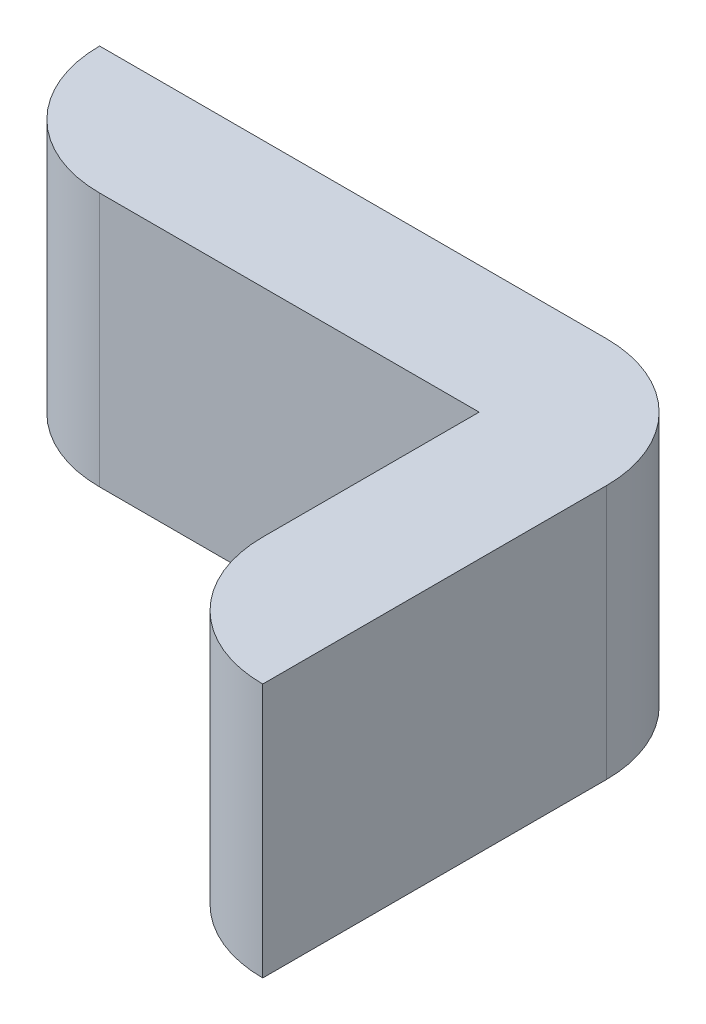
ISO-10303-21;
HEADER;
FILE_DESCRIPTION(('STEP AP214'),'2;1');
FILE_NAME('part.step','',(''),(''),'','','');
FILE_SCHEMA(('AUTOMOTIVE_DESIGN { 1 0 10303 214 1 1 1 1 }'));
ENDSEC;
DATA;
#1=APPLICATION_CONTEXT('core data for automotive mechanical design processes');
#2=APPLICATION_PROTOCOL_DEFINITION('international standard','automotive_design',2000,#1);
#3=PRODUCT_CONTEXT('',#1,'mechanical');
#4=PRODUCT('Part','Part','',(#3));
#5=PRODUCT_RELATED_PRODUCT_CATEGORY('part','',(#4));
#6=PRODUCT_DEFINITION_FORMATION('','',#4);
#7=PRODUCT_DEFINITION_CONTEXT('part definition',#1,'design');
#8=PRODUCT_DEFINITION('design','',#6,#7);
#9=PRODUCT_DEFINITION_SHAPE('','',#8);
#10=(LENGTH_UNIT() NAMED_UNIT(*) SI_UNIT(.MILLI.,.METRE.));
#11=(NAMED_UNIT(*) PLANE_ANGLE_UNIT() SI_UNIT($,.RADIAN.));
#12=(NAMED_UNIT(*) SI_UNIT($,.STERADIAN.) SOLID_ANGLE_UNIT());
#13=UNCERTAINTY_MEASURE_WITH_UNIT(LENGTH_MEASURE(1.E-05),#10,'distance_accuracy_value','');
#14=(GEOMETRIC_REPRESENTATION_CONTEXT(3) GLOBAL_UNCERTAINTY_ASSIGNED_CONTEXT((#13)) GLOBAL_UNIT_ASSIGNED_CONTEXT((#10,
#11,#12)) REPRESENTATION_CONTEXT('',''));
#15=CARTESIAN_POINT('',(0.,0.,0.));
#16=DIRECTION('',(0.,0.,1.));
#17=DIRECTION('',(1.,0.,0.));
#18=AXIS2_PLACEMENT_3D('',#15,#16,#17);
#19=CARTESIAN_POINT('',(-0.396,-1.3462,0.4699));
#20=DIRECTION('',(-1.,0.,0.));
#21=DIRECTION('',(0.,0.,1.));
#22=AXIS2_PLACEMENT_3D('',#19,#20,#21);
#23=PLANE('',#22);
#24=DIRECTION('',(0.,0.,-1.));
#25=VECTOR('',#24,1.);
#26=CARTESIAN_POINT('',(-0.396,-1.3462,0.));
#27=LINE('',#26,#25);
#28=CARTESIAN_POINT('',(-0.396,-1.3462,0.127));
#29=VERTEX_POINT('',#28);
#30=CARTESIAN_POINT('',(-0.396,-1.3462,0.4699));
#31=VERTEX_POINT('',#30);
#32=EDGE_CURVE('E129',#29,#31,#27,.F.);
#33=ORIENTED_EDGE('',*,*,#32,.F.);
#34=DIRECTION('',(0.,-1.,0.));
#35=VECTOR('',#34,1.);
#36=CARTESIAN_POINT('',(-0.396,-1.3462,0.127));
#37=LINE('',#36,#35);
#38=CARTESIAN_POINT('',(-0.396,-1.0922,0.127));
#39=VERTEX_POINT('',#38);
#40=EDGE_CURVE('E82',#39,#29,#37,.T.);
#41=ORIENTED_EDGE('',*,*,#40,.F.);
#42=DIRECTION('',(0.,0.,-1.));
#43=VECTOR('',#42,1.);
#44=CARTESIAN_POINT('',(-0.396,-1.0922,0.));
#45=LINE('',#44,#43);
#46=CARTESIAN_POINT('',(-0.396,-1.0922,0.4699));
#47=VERTEX_POINT('',#46);
#48=EDGE_CURVE('E77',#39,#47,#45,.F.);
#49=ORIENTED_EDGE('',*,*,#48,.T.);
#50=DIRECTION('',(0.,-1.,0.));
#51=VECTOR('',#50,1.);
#52=CARTESIAN_POINT('',(-0.396,-1.3462,0.4699));
#53=LINE('',#52,#51);
#54=EDGE_CURVE('E123',#31,#47,#53,.F.);
#55=ORIENTED_EDGE('',*,*,#54,.F.);
#56=EDGE_LOOP('',(#33,#41,#49,#55));
#57=FACE_BOUND('',#56,.T.);
#58=ADVANCED_FACE('F17',(#57),#23,.F.);
#59=CARTESIAN_POINT('',(-0.396,-1.3462,0.3429));
#60=DIRECTION('',(0.,-1.,0.));
#61=DIRECTION('',(0.,0.,-1.));
#62=AXIS2_PLACEMENT_3D('',#59,#60,#61);
#63=CYLINDRICAL_SURFACE('',#62,0.127);
#64=CARTESIAN_POINT('',(-0.396,-1.0922,0.3429));
#65=DIRECTION('',(0.,-1.,0.));
#66=DIRECTION('',(0.,0.,-1.));
#67=AXIS2_PLACEMENT_3D('',#64,#65,#66);
#68=CIRCLE('',#67,0.127);
#69=CARTESIAN_POINT('',(-0.523,-1.0922,0.3429));
#70=VERTEX_POINT('',#69);
#71=EDGE_CURVE('E107',#47,#70,#68,.T.);
#72=ORIENTED_EDGE('',*,*,#71,.T.);
#73=DIRECTION('',(0.,1.,0.));
#74=VECTOR('',#73,1.);
#75=CARTESIAN_POINT('',(-0.523,-1.3462,0.3429));
#76=LINE('',#75,#74);
#77=CARTESIAN_POINT('',(-0.523,-1.3462,0.3429));
#78=VERTEX_POINT('',#77);
#79=EDGE_CURVE('E118',#70,#78,#76,.F.);
#80=ORIENTED_EDGE('',*,*,#79,.T.);
#81=CARTESIAN_POINT('',(-0.396,-1.3462,0.3429));
#82=DIRECTION('',(0.,-1.,0.));
#83=DIRECTION('',(0.,0.,-1.));
#84=AXIS2_PLACEMENT_3D('',#81,#82,#83);
#85=CIRCLE('',#84,0.127);
#86=EDGE_CURVE('E126',#31,#78,#85,.T.);
#87=ORIENTED_EDGE('',*,*,#86,.F.);
#88=ORIENTED_EDGE('',*,*,#54,.T.);
#89=EDGE_LOOP('',(#72,#80,#87,#88));
#90=FACE_BOUND('',#89,.T.);
#91=ADVANCED_FACE('F133',(#90),#63,.T.);
#92=CARTESIAN_POINT('',(-0.523,-1.3462,0.127));
#93=DIRECTION('',(1.,0.,0.));
#94=DIRECTION('',(0.,0.,-1.));
#95=AXIS2_PLACEMENT_3D('',#92,#93,#94);
#96=PLANE('',#95);
#97=ORIENTED_EDGE('',*,*,#79,.F.);
#98=DIRECTION('',(0.,0.,-1.));
#99=VECTOR('',#98,1.);
#100=CARTESIAN_POINT('',(-0.523,-1.0922,0.));
#101=LINE('',#100,#99);
#102=CARTESIAN_POINT('',(-0.523,-1.0922,0.127));
#103=VERTEX_POINT('',#102);
#104=EDGE_CURVE('E102',#70,#103,#101,.T.);
#105=ORIENTED_EDGE('',*,*,#104,.T.);
#106=DIRECTION('',(0.,1.,0.));
#107=VECTOR('',#106,1.);
#108=CARTESIAN_POINT('',(-0.523,-1.3462,0.127));
#109=LINE('',#108,#107);
#110=CARTESIAN_POINT('',(-0.523,-1.3462,0.127));
#111=VERTEX_POINT('',#110);
#112=EDGE_CURVE('E115',#103,#111,#109,.F.);
#113=ORIENTED_EDGE('',*,*,#112,.T.);
#114=DIRECTION('',(0.,0.,-1.));
#115=VECTOR('',#114,1.);
#116=CARTESIAN_POINT('',(-0.523,-1.3462,0.));
#117=LINE('',#116,#115);
#118=EDGE_CURVE('E128',#78,#111,#117,.T.);
#119=ORIENTED_EDGE('',*,*,#118,.F.);
#120=EDGE_LOOP('',(#97,#105,#113,#119));
#121=FACE_BOUND('',#120,.T.);
#122=ADVANCED_FACE('F158',(#121),#96,.F.);
#123=CARTESIAN_POINT('',(-0.9017,-1.3462,0.127));
#124=DIRECTION('',(0.,0.,-1.));
#125=DIRECTION('',(-1.,0.,0.));
#126=AXIS2_PLACEMENT_3D('',#123,#124,#125);
#127=PLANE('',#126);
#128=ORIENTED_EDGE('',*,*,#112,.F.);
#129=DIRECTION('',(1.,0.,0.));
#130=VECTOR('',#129,1.);
#131=CARTESIAN_POINT('',(-1.0287,-1.0922,0.127));
#132=LINE('',#131,#130);
#133=CARTESIAN_POINT('',(-0.9017,-1.0922,0.127));
#134=VERTEX_POINT('',#133);
#135=EDGE_CURVE('E98',#103,#134,#132,.F.);
#136=ORIENTED_EDGE('',*,*,#135,.T.);
#137=DIRECTION('',(0.,-1.,0.));
#138=VECTOR('',#137,1.);
#139=CARTESIAN_POINT('',(-0.9017,-1.3462,0.127));
#140=LINE('',#139,#138);
#141=CARTESIAN_POINT('',(-0.9017,-1.3462,0.127));
#142=VERTEX_POINT('',#141);
#143=EDGE_CURVE('E101',#142,#134,#140,.F.);
#144=ORIENTED_EDGE('',*,*,#143,.F.);
#145=DIRECTION('',(1.,0.,0.));
#146=VECTOR('',#145,1.);
#147=CARTESIAN_POINT('',(-1.0287,-1.3462,0.127));
#148=LINE('',#147,#146);
#149=EDGE_CURVE('E94',#111,#142,#148,.F.);
#150=ORIENTED_EDGE('',*,*,#149,.F.);
#151=EDGE_LOOP('',(#128,#136,#144,#150));
#152=FACE_BOUND('',#151,.T.);
#153=ADVANCED_FACE('F156',(#152),#127,.F.);
#154=CARTESIAN_POINT('',(-0.523,-1.3462,0.127));
#155=DIRECTION('',(0.,-1.,0.));
#156=DIRECTION('',(0.,0.,-1.));
#157=AXIS2_PLACEMENT_3D('',#154,#155,#156);
#158=CYLINDRICAL_SURFACE('',#157,0.127);
#159=CARTESIAN_POINT('',(-0.523,-1.0922,0.127));
#160=DIRECTION('',(0.,-1.,0.));
#161=DIRECTION('',(0.,0.,-1.));
#162=AXIS2_PLACEMENT_3D('',#159,#160,#161);
#163=CIRCLE('',#162,0.127);
#164=CARTESIAN_POINT('',(-0.523,-1.0922,0.));
#165=VERTEX_POINT('',#164);
#166=EDGE_CURVE('E20',#165,#39,#163,.T.);
#167=ORIENTED_EDGE('',*,*,#166,.T.);
#168=ORIENTED_EDGE('',*,*,#40,.T.);
#169=CARTESIAN_POINT('',(-0.523,-1.3462,0.127));
#170=DIRECTION('',(0.,-1.,0.));
#171=DIRECTION('',(0.,0.,-1.));
#172=AXIS2_PLACEMENT_3D('',#169,#170,#171);
#173=CIRCLE('',#172,0.127);
#174=CARTESIAN_POINT('',(-0.523,-1.3462,0.));
#175=VERTEX_POINT('',#174);
#176=EDGE_CURVE('E92',#175,#29,#173,.T.);
#177=ORIENTED_EDGE('',*,*,#176,.F.);
#178=DIRECTION('',(0.,1.,0.));
#179=VECTOR('',#178,1.);
#180=CARTESIAN_POINT('',(-0.523,-1.3462,0.));
#181=LINE('',#180,#179);
#182=EDGE_CURVE('E86',#175,#165,#181,.T.);
#183=ORIENTED_EDGE('',*,*,#182,.T.);
#184=EDGE_LOOP('',(#167,#168,#177,#183));
#185=FACE_BOUND('',#184,.T.);
#186=ADVANCED_FACE('F90',(#185),#158,.T.);
#187=CARTESIAN_POINT('',(-1.0287,-1.0922,0.));
#188=DIRECTION('',(0.,-1.,0.));
#189=DIRECTION('',(0.,0.,-1.));
#190=AXIS2_PLACEMENT_3D('',#187,#188,#189);
#191=PLANE('',#190);
#192=ORIENTED_EDGE('',*,*,#135,.F.);
#193=ORIENTED_EDGE('',*,*,#104,.F.);
#194=ORIENTED_EDGE('',*,*,#71,.F.);
#195=ORIENTED_EDGE('',*,*,#48,.F.);
#196=ORIENTED_EDGE('',*,*,#166,.F.);
#197=DIRECTION('',(1.,0.,0.));
#198=VECTOR('',#197,1.);
#199=CARTESIAN_POINT('',(-0.523,-1.0922,0.));
#200=LINE('',#199,#198);
#201=CARTESIAN_POINT('',(-1.0287,-1.0922,0.));
#202=VERTEX_POINT('',#201);
#203=EDGE_CURVE('E74',#165,#202,#200,.F.);
#204=ORIENTED_EDGE('',*,*,#203,.T.);
#205=CARTESIAN_POINT('',(-0.9017,-1.0922,0.));
#206=DIRECTION('',(0.,-1.,0.));
#207=DIRECTION('',(0.,0.,-1.));
#208=AXIS2_PLACEMENT_3D('',#205,#206,#207);
#209=CIRCLE('',#208,0.127);
#210=EDGE_CURVE('E114',#134,#202,#209,.T.);
#211=ORIENTED_EDGE('',*,*,#210,.F.);
#212=EDGE_LOOP('',(#192,#193,#194,#195,#196,#204,#211));
#213=FACE_BOUND('',#212,.T.);
#214=ADVANCED_FACE('F72',(#213),#191,.F.);
#215=CARTESIAN_POINT('',(-0.9017,-1.3462,0.));
#216=DIRECTION('',(0.,-1.,0.));
#217=DIRECTION('',(0.,0.,-1.));
#218=AXIS2_PLACEMENT_3D('',#215,#216,#217);
#219=CYLINDRICAL_SURFACE('',#218,0.127);
#220=ORIENTED_EDGE('',*,*,#210,.T.);
#221=DIRECTION('',(0.,1.,0.));
#222=VECTOR('',#221,1.);
#223=CARTESIAN_POINT('',(-1.0287,-1.3462,0.));
#224=LINE('',#223,#222);
#225=CARTESIAN_POINT('',(-1.0287,-1.3462,0.));
#226=VERTEX_POINT('',#225);
#227=EDGE_CURVE('E26',#202,#226,#224,.F.);
#228=ORIENTED_EDGE('',*,*,#227,.T.);
#229=CARTESIAN_POINT('',(-0.9017,-1.3462,0.));
#230=DIRECTION('',(0.,-1.,0.));
#231=DIRECTION('',(0.,0.,-1.));
#232=AXIS2_PLACEMENT_3D('',#229,#230,#231);
#233=CIRCLE('',#232,0.127);
#234=EDGE_CURVE('E34',#142,#226,#233,.T.);
#235=ORIENTED_EDGE('',*,*,#234,.F.);
#236=ORIENTED_EDGE('',*,*,#143,.T.);
#237=EDGE_LOOP('',(#220,#228,#235,#236));
#238=FACE_BOUND('',#237,.T.);
#239=ADVANCED_FACE('F141',(#238),#219,.T.);
#240=CARTESIAN_POINT('',(-1.0287,-1.3462,0.));
#241=DIRECTION('',(0.,-1.,0.));
#242=DIRECTION('',(0.,0.,-1.));
#243=AXIS2_PLACEMENT_3D('',#240,#241,#242);
#244=PLANE('',#243);
#245=ORIENTED_EDGE('',*,*,#149,.T.);
#246=ORIENTED_EDGE('',*,*,#234,.T.);
#247=DIRECTION('',(1.,0.,0.));
#248=VECTOR('',#247,1.);
#249=CARTESIAN_POINT('',(-0.523,-1.3462,0.));
#250=LINE('',#249,#248);
#251=EDGE_CURVE('E11',#226,#175,#250,.T.);
#252=ORIENTED_EDGE('',*,*,#251,.T.);
#253=ORIENTED_EDGE('',*,*,#176,.T.);
#254=ORIENTED_EDGE('',*,*,#32,.T.);
#255=ORIENTED_EDGE('',*,*,#86,.T.);
#256=ORIENTED_EDGE('',*,*,#118,.T.);
#257=EDGE_LOOP('',(#245,#246,#252,#253,#254,#255,#256));
#258=FACE_BOUND('',#257,.T.);
#259=ADVANCED_FACE('F139',(#258),#244,.T.);
#260=CARTESIAN_POINT('',(-0.523,-1.3462,0.));
#261=DIRECTION('',(0.,0.,1.));
#262=DIRECTION('',(1.,0.,0.));
#263=AXIS2_PLACEMENT_3D('',#260,#261,#262);
#264=PLANE('',#263);
#265=ORIENTED_EDGE('',*,*,#227,.F.);
#266=ORIENTED_EDGE('',*,*,#203,.F.);
#267=ORIENTED_EDGE('',*,*,#182,.F.);
#268=ORIENTED_EDGE('',*,*,#251,.F.);
#269=EDGE_LOOP('',(#265,#266,#267,#268));
#270=FACE_BOUND('',#269,.T.);
#271=ADVANCED_FACE('F85',(#270),#264,.F.);
#272=CLOSED_SHELL('',(#58,#91,#122,#153,#186,#214,#239,#259,#271));
#273=MANIFOLD_SOLID_BREP('B1',#272);
#274=ADVANCED_BREP_SHAPE_REPRESENTATION('',(#18,#273),#14);
#275=SHAPE_DEFINITION_REPRESENTATION(#9,#274);
ENDSEC;
END-ISO-10303-21;
